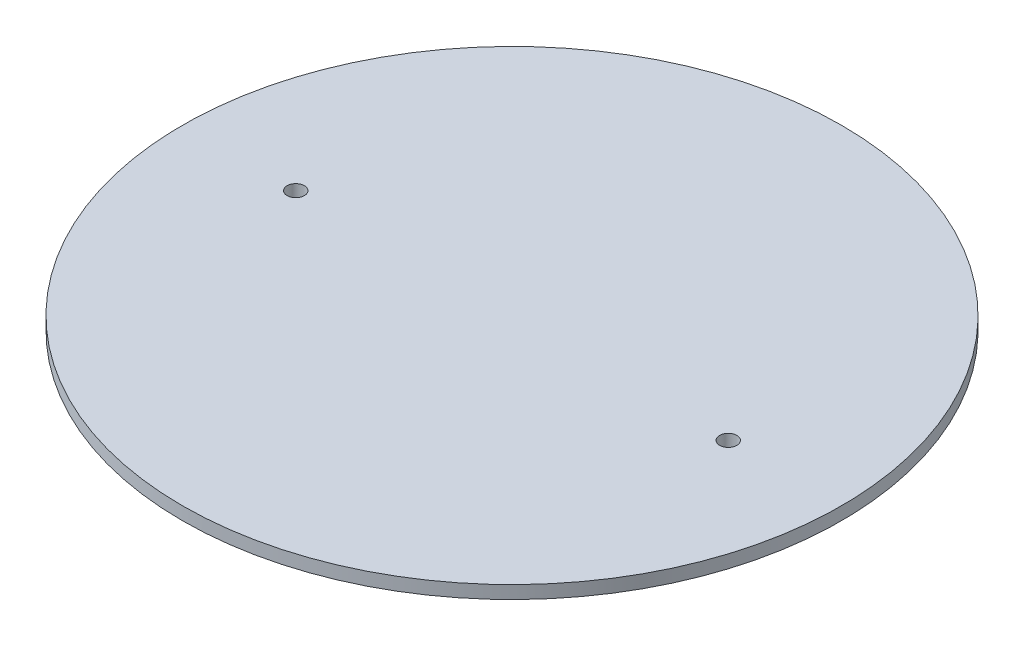
ISO-10303-21;
HEADER;
FILE_DESCRIPTION(('STEP AP214'),'2;1');
FILE_NAME('part.step','',(''),(''),'','','');
FILE_SCHEMA(('AUTOMOTIVE_DESIGN { 1 0 10303 214 1 1 1 1 }'));
ENDSEC;
DATA;
#1=APPLICATION_CONTEXT('core data for automotive mechanical design processes');
#2=APPLICATION_PROTOCOL_DEFINITION('international standard','automotive_design',2000,#1);
#3=PRODUCT_CONTEXT('',#1,'mechanical');
#4=PRODUCT('Part','Part','',(#3));
#5=PRODUCT_RELATED_PRODUCT_CATEGORY('part','',(#4));
#6=PRODUCT_DEFINITION_FORMATION('','',#4);
#7=PRODUCT_DEFINITION_CONTEXT('part definition',#1,'design');
#8=PRODUCT_DEFINITION('design','',#6,#7);
#9=PRODUCT_DEFINITION_SHAPE('','',#8);
#10=(LENGTH_UNIT() NAMED_UNIT(*) SI_UNIT(.MILLI.,.METRE.));
#11=(NAMED_UNIT(*) PLANE_ANGLE_UNIT() SI_UNIT($,.RADIAN.));
#12=(NAMED_UNIT(*) SI_UNIT($,.STERADIAN.) SOLID_ANGLE_UNIT());
#13=UNCERTAINTY_MEASURE_WITH_UNIT(LENGTH_MEASURE(1.E-05),#10,'distance_accuracy_value','');
#14=(GEOMETRIC_REPRESENTATION_CONTEXT(3) GLOBAL_UNCERTAINTY_ASSIGNED_CONTEXT((#13)) GLOBAL_UNIT_ASSIGNED_CONTEXT((#10,
#11,#12)) REPRESENTATION_CONTEXT('',''));
#15=CARTESIAN_POINT('',(0.,0.,0.));
#16=DIRECTION('',(0.,0.,1.));
#17=DIRECTION('',(1.,0.,0.));
#18=AXIS2_PLACEMENT_3D('',#15,#16,#17);
#19=CARTESIAN_POINT('',(0.,-1.5,0.));
#20=DIRECTION('',(0.,1.,0.));
#21=DIRECTION('',(0.,0.,1.));
#22=AXIS2_PLACEMENT_3D('',#19,#20,#21);
#23=CYLINDRICAL_SURFACE('',#22,76.2);
#24=CARTESIAN_POINT('',(0.,-1.5,0.));
#25=DIRECTION('',(0.,1.,0.));
#26=DIRECTION('',(0.,0.,1.));
#27=AXIS2_PLACEMENT_3D('',#24,#25,#26);
#28=CIRCLE('',#27,76.2);
#29=CARTESIAN_POINT('',(0.,-1.5,76.2));
#30=VERTEX_POINT('',#29);
#31=EDGE_CURVE('E10',#30,#30,#28,.T.);
#32=ORIENTED_EDGE('',*,*,#31,.T.);
#33=EDGE_LOOP('',(#32));
#34=FACE_BOUND('',#33,.T.);
#35=CARTESIAN_POINT('',(0.,1.5,0.));
#36=DIRECTION('',(0.,1.,0.));
#37=DIRECTION('',(0.,0.,1.));
#38=AXIS2_PLACEMENT_3D('',#35,#36,#37);
#39=CIRCLE('',#38,76.2);
#40=CARTESIAN_POINT('',(0.,1.5,76.2));
#41=VERTEX_POINT('',#40);
#42=EDGE_CURVE('E54',#41,#41,#39,.T.);
#43=ORIENTED_EDGE('',*,*,#42,.F.);
#44=EDGE_LOOP('',(#43));
#45=FACE_BOUND('',#44,.T.);
#46=ADVANCED_FACE('F37',(#34,#45),#23,.T.);
#47=CARTESIAN_POINT('',(0.,-1.5,0.));
#48=DIRECTION('',(0.,1.,0.));
#49=DIRECTION('',(0.,0.,1.));
#50=AXIS2_PLACEMENT_3D('',#47,#48,#49);
#51=PLANE('',#50);
#52=CARTESIAN_POINT('',(50.,-1.5,0.));
#53=DIRECTION('',(0.,1.,0.));
#54=DIRECTION('',(0.,0.,1.));
#55=AXIS2_PLACEMENT_3D('',#52,#53,#54);
#56=CIRCLE('',#55,2.);
#57=CARTESIAN_POINT('',(50.,-1.5,1.99999999999998));
#58=VERTEX_POINT('',#57);
#59=EDGE_CURVE('E49',#58,#58,#56,.T.);
#60=ORIENTED_EDGE('',*,*,#59,.T.);
#61=EDGE_LOOP('',(#60));
#62=FACE_BOUND('',#61,.T.);
#63=CARTESIAN_POINT('',(-50.,-1.5,0.));
#64=DIRECTION('',(0.,1.,0.));
#65=DIRECTION('',(0.,0.,1.));
#66=AXIS2_PLACEMENT_3D('',#63,#64,#65);
#67=CIRCLE('',#66,2.);
#68=CARTESIAN_POINT('',(-50.,-1.5,2.));
#69=VERTEX_POINT('',#68);
#70=EDGE_CURVE('E44',#69,#69,#67,.T.);
#71=ORIENTED_EDGE('',*,*,#70,.T.);
#72=EDGE_LOOP('',(#71));
#73=FACE_BOUND('',#72,.T.);
#74=ORIENTED_EDGE('',*,*,#31,.F.);
#75=EDGE_LOOP('',(#74));
#76=FACE_BOUND('',#75,.T.);
#77=ADVANCED_FACE('F84',(#62,#73,#76),#51,.F.);
#78=CARTESIAN_POINT('',(-50.,-1.5,0.));
#79=DIRECTION('',(0.,1.,0.));
#80=DIRECTION('',(0.,0.,1.));
#81=AXIS2_PLACEMENT_3D('',#78,#79,#80);
#82=CYLINDRICAL_SURFACE('',#81,2.);
#83=ORIENTED_EDGE('',*,*,#70,.F.);
#84=EDGE_LOOP('',(#83));
#85=FACE_BOUND('',#84,.T.);
#86=CARTESIAN_POINT('',(-50.,1.5,0.));
#87=DIRECTION('',(0.,1.,0.));
#88=DIRECTION('',(0.,0.,1.));
#89=AXIS2_PLACEMENT_3D('',#86,#87,#88);
#90=CIRCLE('',#89,2.);
#91=CARTESIAN_POINT('',(-50.,1.5,2.));
#92=VERTEX_POINT('',#91);
#93=EDGE_CURVE('E60',#92,#92,#90,.T.);
#94=ORIENTED_EDGE('',*,*,#93,.T.);
#95=EDGE_LOOP('',(#94));
#96=FACE_BOUND('',#95,.T.);
#97=ADVANCED_FACE('F78',(#85,#96),#82,.F.);
#98=CARTESIAN_POINT('',(50.,-1.5,0.));
#99=DIRECTION('',(0.,1.,0.));
#100=DIRECTION('',(0.,0.,1.));
#101=AXIS2_PLACEMENT_3D('',#98,#99,#100);
#102=CYLINDRICAL_SURFACE('',#101,2.);
#103=ORIENTED_EDGE('',*,*,#59,.F.);
#104=EDGE_LOOP('',(#103));
#105=FACE_BOUND('',#104,.T.);
#106=CARTESIAN_POINT('',(50.,1.5,0.));
#107=DIRECTION('',(0.,1.,0.));
#108=DIRECTION('',(0.,0.,1.));
#109=AXIS2_PLACEMENT_3D('',#106,#107,#108);
#110=CIRCLE('',#109,2.);
#111=CARTESIAN_POINT('',(50.,1.5,1.99999999999998));
#112=VERTEX_POINT('',#111);
#113=EDGE_CURVE('E64',#112,#112,#110,.T.);
#114=ORIENTED_EDGE('',*,*,#113,.T.);
#115=EDGE_LOOP('',(#114));
#116=FACE_BOUND('',#115,.T.);
#117=ADVANCED_FACE('F69',(#105,#116),#102,.F.);
#118=CARTESIAN_POINT('',(0.,1.5,0.));
#119=DIRECTION('',(0.,1.,0.));
#120=DIRECTION('',(0.,0.,1.));
#121=AXIS2_PLACEMENT_3D('',#118,#119,#120);
#122=PLANE('',#121);
#123=ORIENTED_EDGE('',*,*,#93,.F.);
#124=EDGE_LOOP('',(#123));
#125=FACE_BOUND('',#124,.T.);
#126=ORIENTED_EDGE('',*,*,#42,.T.);
#127=EDGE_LOOP('',(#126));
#128=FACE_BOUND('',#127,.T.);
#129=ORIENTED_EDGE('',*,*,#113,.F.);
#130=EDGE_LOOP('',(#129));
#131=FACE_BOUND('',#130,.T.);
#132=ADVANCED_FACE('F71',(#125,#128,#131),#122,.T.);
#133=CLOSED_SHELL('',(#46,#77,#97,#117,#132));
#134=MANIFOLD_SOLID_BREP('B2',#133);
#135=ADVANCED_BREP_SHAPE_REPRESENTATION('',(#18,#134),#14);
#136=SHAPE_DEFINITION_REPRESENTATION(#9,#135);
ENDSEC;
END-ISO-10303-21;
